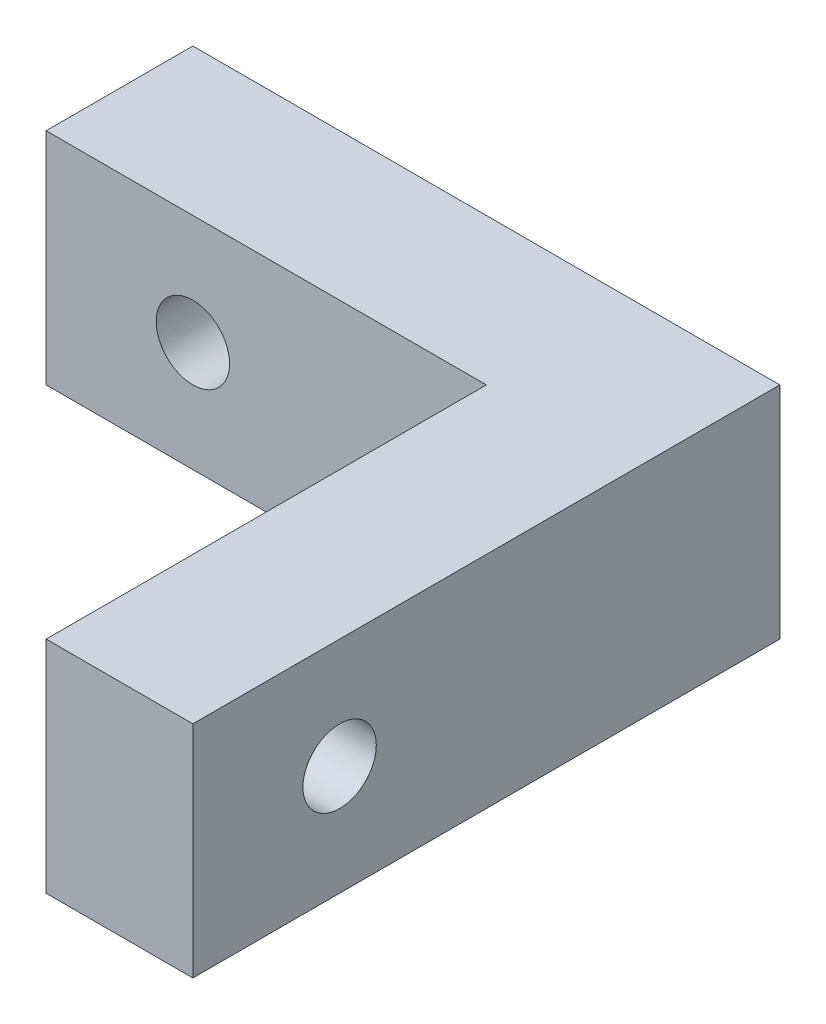
ISO-10303-21;
HEADER;
FILE_DESCRIPTION(('STEP AP214'),'2;1');
FILE_NAME('part.step','',(''),(''),'','','');
FILE_SCHEMA(('AUTOMOTIVE_DESIGN { 1 0 10303 214 1 1 1 1 }'));
ENDSEC;
DATA;
#1=APPLICATION_CONTEXT('core data for automotive mechanical design processes');
#2=APPLICATION_PROTOCOL_DEFINITION('international standard','automotive_design',2000,#1);
#3=PRODUCT_CONTEXT('',#1,'mechanical');
#4=PRODUCT('Part','Part','',(#3));
#5=PRODUCT_RELATED_PRODUCT_CATEGORY('part','',(#4));
#6=PRODUCT_DEFINITION_FORMATION('','',#4);
#7=PRODUCT_DEFINITION_CONTEXT('part definition',#1,'design');
#8=PRODUCT_DEFINITION('design','',#6,#7);
#9=PRODUCT_DEFINITION_SHAPE('','',#8);
#10=(LENGTH_UNIT() NAMED_UNIT(*) SI_UNIT(.MILLI.,.METRE.));
#11=(NAMED_UNIT(*) PLANE_ANGLE_UNIT() SI_UNIT($,.RADIAN.));
#12=(NAMED_UNIT(*) SI_UNIT($,.STERADIAN.) SOLID_ANGLE_UNIT());
#13=UNCERTAINTY_MEASURE_WITH_UNIT(LENGTH_MEASURE(1.E-05),#10,'distance_accuracy_value','');
#14=(GEOMETRIC_REPRESENTATION_CONTEXT(3) GLOBAL_UNCERTAINTY_ASSIGNED_CONTEXT((#13)) GLOBAL_UNIT_ASSIGNED_CONTEXT((#10,
#11,#12)) REPRESENTATION_CONTEXT('',''));
#15=CARTESIAN_POINT('',(0.,0.,0.));
#16=DIRECTION('',(0.,0.,1.));
#17=DIRECTION('',(1.,0.,0.));
#18=AXIS2_PLACEMENT_3D('',#15,#16,#17);
#19=CARTESIAN_POINT('',(40.,0.,20.));
#20=DIRECTION('',(1.,0.,0.));
#21=DIRECTION('',(0.,1.,0.));
#22=AXIS2_PLACEMENT_3D('',#19,#20,#21);
#23=PLANE('',#22);
#24=CARTESIAN_POINT('',(40.,0.,60.));
#25=DIRECTION('',(1.,0.,0.));
#26=DIRECTION('',(0.,1.,0.));
#27=AXIS2_PLACEMENT_3D('',#24,#25,#26);
#28=CIRCLE('',#27,5.);
#29=CARTESIAN_POINT('',(40.,5.00000000000002,60.));
#30=VERTEX_POINT('',#29);
#31=EDGE_CURVE('E164',#30,#30,#28,.T.);
#32=ORIENTED_EDGE('',*,*,#31,.F.);
#33=EDGE_LOOP('',(#32));
#34=FACE_BOUND('',#33,.T.);
#35=DIRECTION('',(0.,-1.,0.));
#36=VECTOR('',#35,1.);
#37=CARTESIAN_POINT('',(40.,0.,0.));
#38=LINE('',#37,#36);
#39=CARTESIAN_POINT('',(40.,15.,0.));
#40=VERTEX_POINT('',#39);
#41=CARTESIAN_POINT('',(40.,-15.,0.));
#42=VERTEX_POINT('',#41);
#43=EDGE_CURVE('E89',#40,#42,#38,.T.);
#44=ORIENTED_EDGE('',*,*,#43,.F.);
#45=DIRECTION('',(0.,0.,-1.));
#46=VECTOR('',#45,1.);
#47=CARTESIAN_POINT('',(40.,15.,20.));
#48=LINE('',#47,#46);
#49=CARTESIAN_POINT('',(40.,15.,80.));
#50=VERTEX_POINT('',#49);
#51=EDGE_CURVE('E11',#50,#40,#48,.T.);
#52=ORIENTED_EDGE('',*,*,#51,.F.);
#53=DIRECTION('',(0.,1.,0.));
#54=VECTOR('',#53,1.);
#55=CARTESIAN_POINT('',(40.,-15.,80.));
#56=LINE('',#55,#54);
#57=CARTESIAN_POINT('',(40.,-15.,80.));
#58=VERTEX_POINT('',#57);
#59=EDGE_CURVE('E92',#58,#50,#56,.T.);
#60=ORIENTED_EDGE('',*,*,#59,.F.);
#61=DIRECTION('',(0.,0.,-1.));
#62=VECTOR('',#61,1.);
#63=CARTESIAN_POINT('',(40.,-15.,20.));
#64=LINE('',#63,#62);
#65=EDGE_CURVE('E85',#58,#42,#64,.T.);
#66=ORIENTED_EDGE('',*,*,#65,.T.);
#67=EDGE_LOOP('',(#44,#52,#60,#66));
#68=FACE_BOUND('',#67,.T.);
#69=ADVANCED_FACE('F41',(#34,#68),#23,.T.);
#70=CARTESIAN_POINT('',(0.,15.,20.));
#71=DIRECTION('',(0.,1.,0.));
#72=DIRECTION('',(0.,0.,1.));
#73=AXIS2_PLACEMENT_3D('',#70,#71,#72);
#74=PLANE('',#73);
#75=DIRECTION('',(1.,0.,0.));
#76=VECTOR('',#75,1.);
#77=CARTESIAN_POINT('',(0.,15.,0.));
#78=LINE('',#77,#76);
#79=CARTESIAN_POINT('',(-40.,15.,0.));
#80=VERTEX_POINT('',#79);
#81=EDGE_CURVE('E110',#80,#40,#78,.T.);
#82=ORIENTED_EDGE('',*,*,#81,.F.);
#83=DIRECTION('',(0.,0.,-1.));
#84=VECTOR('',#83,1.);
#85=CARTESIAN_POINT('',(-40.,15.,20.));
#86=LINE('',#85,#84);
#87=CARTESIAN_POINT('',(-40.,15.,20.));
#88=VERTEX_POINT('',#87);
#89=EDGE_CURVE('E50',#88,#80,#86,.T.);
#90=ORIENTED_EDGE('',*,*,#89,.F.);
#91=DIRECTION('',(1.,0.,0.));
#92=VECTOR('',#91,1.);
#93=CARTESIAN_POINT('',(0.,15.,20.));
#94=LINE('',#93,#92);
#95=CARTESIAN_POINT('',(20.,15.,20.));
#96=VERTEX_POINT('',#95);
#97=EDGE_CURVE('E171',#88,#96,#94,.T.);
#98=ORIENTED_EDGE('',*,*,#97,.T.);
#99=DIRECTION('',(0.,0.,-1.));
#100=VECTOR('',#99,1.);
#101=CARTESIAN_POINT('',(20.,15.,80.));
#102=LINE('',#101,#100);
#103=CARTESIAN_POINT('',(20.,15.,80.));
#104=VERTEX_POINT('',#103);
#105=EDGE_CURVE('E118',#104,#96,#102,.T.);
#106=ORIENTED_EDGE('',*,*,#105,.F.);
#107=DIRECTION('',(-1.,0.,0.));
#108=VECTOR('',#107,1.);
#109=CARTESIAN_POINT('',(40.,15.,80.));
#110=LINE('',#109,#108);
#111=EDGE_CURVE('E136',#50,#104,#110,.T.);
#112=ORIENTED_EDGE('',*,*,#111,.F.);
#113=ORIENTED_EDGE('',*,*,#51,.T.);
#114=EDGE_LOOP('',(#82,#90,#98,#106,#112,#113));
#115=FACE_BOUND('',#114,.T.);
#116=ADVANCED_FACE('F131',(#115),#74,.T.);
#117=CARTESIAN_POINT('',(-40.,0.,20.));
#118=DIRECTION('',(1.,0.,0.));
#119=DIRECTION('',(0.,1.,0.));
#120=AXIS2_PLACEMENT_3D('',#117,#118,#119);
#121=PLANE('',#120);
#122=DIRECTION('',(0.,-1.,0.));
#123=VECTOR('',#122,1.);
#124=CARTESIAN_POINT('',(-40.,0.,0.));
#125=LINE('',#124,#123);
#126=CARTESIAN_POINT('',(-40.,-15.,0.));
#127=VERTEX_POINT('',#126);
#128=EDGE_CURVE('E106',#80,#127,#125,.T.);
#129=ORIENTED_EDGE('',*,*,#128,.T.);
#130=DIRECTION('',(0.,0.,-1.));
#131=VECTOR('',#130,1.);
#132=CARTESIAN_POINT('',(-40.,-15.,20.));
#133=LINE('',#132,#131);
#134=CARTESIAN_POINT('',(-40.,-15.,20.));
#135=VERTEX_POINT('',#134);
#136=EDGE_CURVE('E96',#135,#127,#133,.T.);
#137=ORIENTED_EDGE('',*,*,#136,.F.);
#138=DIRECTION('',(0.,-1.,0.));
#139=VECTOR('',#138,1.);
#140=CARTESIAN_POINT('',(-40.,0.,20.));
#141=LINE('',#140,#139);
#142=EDGE_CURVE('E129',#88,#135,#141,.T.);
#143=ORIENTED_EDGE('',*,*,#142,.F.);
#144=ORIENTED_EDGE('',*,*,#89,.T.);
#145=EDGE_LOOP('',(#129,#137,#143,#144));
#146=FACE_BOUND('',#145,.T.);
#147=ADVANCED_FACE('F128',(#146),#121,.F.);
#148=CARTESIAN_POINT('',(-20.,0.,20.));
#149=DIRECTION('',(0.,0.,-1.));
#150=DIRECTION('',(-1.,0.,0.));
#151=AXIS2_PLACEMENT_3D('',#148,#149,#150);
#152=CYLINDRICAL_SURFACE('',#151,5.);
#153=CARTESIAN_POINT('',(-20.,0.,20.));
#154=DIRECTION('',(0.,0.,1.));
#155=DIRECTION('',(1.,0.,0.));
#156=AXIS2_PLACEMENT_3D('',#153,#154,#155);
#157=CIRCLE('',#156,5.);
#158=CARTESIAN_POINT('',(-15.,0.,20.));
#159=VERTEX_POINT('',#158);
#160=EDGE_CURVE('E105',#159,#159,#157,.T.);
#161=ORIENTED_EDGE('',*,*,#160,.T.);
#162=EDGE_LOOP('',(#161));
#163=FACE_BOUND('',#162,.T.);
#164=CARTESIAN_POINT('',(-20.,0.,0.));
#165=DIRECTION('',(0.,0.,1.));
#166=DIRECTION('',(1.,0.,0.));
#167=AXIS2_PLACEMENT_3D('',#164,#165,#166);
#168=CIRCLE('',#167,5.);
#169=CARTESIAN_POINT('',(-15.,0.,0.));
#170=VERTEX_POINT('',#169);
#171=EDGE_CURVE('E112',#170,#170,#168,.T.);
#172=ORIENTED_EDGE('',*,*,#171,.F.);
#173=EDGE_LOOP('',(#172));
#174=FACE_BOUND('',#173,.T.);
#175=ADVANCED_FACE('F43',(#163,#174),#152,.F.);
#176=CARTESIAN_POINT('',(0.,-15.,20.));
#177=DIRECTION('',(0.,1.,0.));
#178=DIRECTION('',(0.,0.,1.));
#179=AXIS2_PLACEMENT_3D('',#176,#177,#178);
#180=PLANE('',#179);
#181=DIRECTION('',(1.,0.,0.));
#182=VECTOR('',#181,1.);
#183=CARTESIAN_POINT('',(0.,-15.,0.));
#184=LINE('',#183,#182);
#185=EDGE_CURVE('E98',#127,#42,#184,.T.);
#186=ORIENTED_EDGE('',*,*,#185,.T.);
#187=ORIENTED_EDGE('',*,*,#65,.F.);
#188=DIRECTION('',(1.,0.,0.));
#189=VECTOR('',#188,1.);
#190=CARTESIAN_POINT('',(20.,-15.,80.));
#191=LINE('',#190,#189);
#192=CARTESIAN_POINT('',(20.,-15.,80.));
#193=VERTEX_POINT('',#192);
#194=EDGE_CURVE('E150',#193,#58,#191,.T.);
#195=ORIENTED_EDGE('',*,*,#194,.F.);
#196=DIRECTION('',(0.,0.,-1.));
#197=VECTOR('',#196,1.);
#198=CARTESIAN_POINT('',(20.,-15.,80.));
#199=LINE('',#198,#197);
#200=CARTESIAN_POINT('',(20.,-15.,20.));
#201=VERTEX_POINT('',#200);
#202=EDGE_CURVE('E155',#193,#201,#199,.T.);
#203=ORIENTED_EDGE('',*,*,#202,.T.);
#204=DIRECTION('',(1.,0.,0.));
#205=VECTOR('',#204,1.);
#206=CARTESIAN_POINT('',(0.,-15.,20.));
#207=LINE('',#206,#205);
#208=EDGE_CURVE('E65',#135,#201,#207,.T.);
#209=ORIENTED_EDGE('',*,*,#208,.F.);
#210=ORIENTED_EDGE('',*,*,#136,.T.);
#211=EDGE_LOOP('',(#186,#187,#195,#203,#209,#210));
#212=FACE_BOUND('',#211,.T.);
#213=ADVANCED_FACE('F99',(#212),#180,.F.);
#214=CARTESIAN_POINT('',(0.,0.,20.));
#215=DIRECTION('',(0.,0.,1.));
#216=DIRECTION('',(1.,0.,0.));
#217=AXIS2_PLACEMENT_3D('',#214,#215,#216);
#218=PLANE('',#217);
#219=DIRECTION('',(0.,-1.,0.));
#220=VECTOR('',#219,1.);
#221=CARTESIAN_POINT('',(20.,15.,20.));
#222=LINE('',#221,#220);
#223=EDGE_CURVE('E57',#96,#201,#222,.T.);
#224=ORIENTED_EDGE('',*,*,#223,.F.);
#225=ORIENTED_EDGE('',*,*,#97,.F.);
#226=ORIENTED_EDGE('',*,*,#142,.T.);
#227=ORIENTED_EDGE('',*,*,#208,.T.);
#228=EDGE_LOOP('',(#224,#225,#226,#227));
#229=FACE_BOUND('',#228,.T.);
#230=ORIENTED_EDGE('',*,*,#160,.F.);
#231=EDGE_LOOP('',(#230));
#232=FACE_BOUND('',#231,.T.);
#233=ADVANCED_FACE('F176',(#229,#232),#218,.T.);
#234=CARTESIAN_POINT('',(0.,0.,0.));
#235=DIRECTION('',(0.,0.,1.));
#236=DIRECTION('',(1.,0.,0.));
#237=AXIS2_PLACEMENT_3D('',#234,#235,#236);
#238=PLANE('',#237);
#239=ORIENTED_EDGE('',*,*,#171,.T.);
#240=EDGE_LOOP('',(#239));
#241=FACE_BOUND('',#240,.T.);
#242=ORIENTED_EDGE('',*,*,#43,.T.);
#243=ORIENTED_EDGE('',*,*,#185,.F.);
#244=ORIENTED_EDGE('',*,*,#128,.F.);
#245=ORIENTED_EDGE('',*,*,#81,.T.);
#246=EDGE_LOOP('',(#242,#243,#244,#245));
#247=FACE_BOUND('',#246,.T.);
#248=ADVANCED_FACE('F108',(#241,#247),#238,.F.);
#249=CARTESIAN_POINT('',(20.,15.,80.));
#250=DIRECTION('',(1.,0.,0.));
#251=DIRECTION('',(0.,1.,0.));
#252=AXIS2_PLACEMENT_3D('',#249,#250,#251);
#253=PLANE('',#252);
#254=CARTESIAN_POINT('',(20.,0.,60.));
#255=DIRECTION('',(-1.,0.,0.));
#256=DIRECTION('',(0.,-1.,0.));
#257=AXIS2_PLACEMENT_3D('',#254,#255,#256);
#258=CIRCLE('',#257,5.);
#259=CARTESIAN_POINT('',(20.,-5.,60.));
#260=VERTEX_POINT('',#259);
#261=EDGE_CURVE('E253',#260,#260,#258,.T.);
#262=ORIENTED_EDGE('',*,*,#261,.F.);
#263=EDGE_LOOP('',(#262));
#264=FACE_BOUND('',#263,.T.);
#265=ORIENTED_EDGE('',*,*,#223,.T.);
#266=ORIENTED_EDGE('',*,*,#202,.F.);
#267=DIRECTION('',(0.,-1.,0.));
#268=VECTOR('',#267,1.);
#269=CARTESIAN_POINT('',(20.,15.,80.));
#270=LINE('',#269,#268);
#271=EDGE_CURVE('E147',#104,#193,#270,.T.);
#272=ORIENTED_EDGE('',*,*,#271,.F.);
#273=ORIENTED_EDGE('',*,*,#105,.T.);
#274=EDGE_LOOP('',(#265,#266,#272,#273));
#275=FACE_BOUND('',#274,.T.);
#276=ADVANCED_FACE('F156',(#264,#275),#253,.F.);
#277=CARTESIAN_POINT('',(0.,0.,80.));
#278=DIRECTION('',(0.,0.,1.));
#279=DIRECTION('',(1.,0.,0.));
#280=AXIS2_PLACEMENT_3D('',#277,#278,#279);
#281=PLANE('',#280);
#282=ORIENTED_EDGE('',*,*,#59,.T.);
#283=ORIENTED_EDGE('',*,*,#111,.T.);
#284=ORIENTED_EDGE('',*,*,#271,.T.);
#285=ORIENTED_EDGE('',*,*,#194,.T.);
#286=EDGE_LOOP('',(#282,#283,#284,#285));
#287=FACE_BOUND('',#286,.T.);
#288=ADVANCED_FACE('F149',(#287),#281,.T.);
#289=CARTESIAN_POINT('',(80.,0.,60.));
#290=DIRECTION('',(-1.,0.,0.));
#291=DIRECTION('',(0.,-1.,0.));
#292=AXIS2_PLACEMENT_3D('',#289,#290,#291);
#293=CYLINDRICAL_SURFACE('',#292,5.);
#294=ORIENTED_EDGE('',*,*,#31,.T.);
#295=EDGE_LOOP('',(#294));
#296=FACE_BOUND('',#295,.T.);
#297=ORIENTED_EDGE('',*,*,#261,.T.);
#298=EDGE_LOOP('',(#297));
#299=FACE_BOUND('',#298,.T.);
#300=ADVANCED_FACE('F223',(#296,#299),#293,.F.);
#301=CLOSED_SHELL('',(#69,#116,#147,#175,#213,#233,#248,#276,#288,#300));
#302=MANIFOLD_SOLID_BREP('B2',#301);
#303=ADVANCED_BREP_SHAPE_REPRESENTATION('',(#18,#302),#14);
#304=SHAPE_DEFINITION_REPRESENTATION(#9,#303);
ENDSEC;
END-ISO-10303-21;
